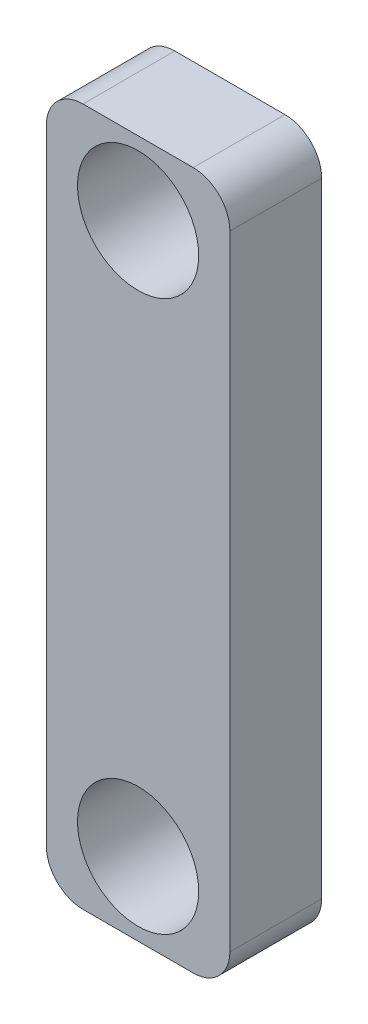
ISO-10303-21;
HEADER;
FILE_DESCRIPTION(('STEP AP214'),'2;1');
FILE_NAME('part.step','',(''),(''),'','','');
FILE_SCHEMA(('AUTOMOTIVE_DESIGN { 1 0 10303 214 1 1 1 1 }'));
ENDSEC;
DATA;
#1=APPLICATION_CONTEXT('core data for automotive mechanical design processes');
#2=APPLICATION_PROTOCOL_DEFINITION('international standard','automotive_design',2000,#1);
#3=PRODUCT_CONTEXT('',#1,'mechanical');
#4=PRODUCT('Part','Part','',(#3));
#5=PRODUCT_RELATED_PRODUCT_CATEGORY('part','',(#4));
#6=PRODUCT_DEFINITION_FORMATION('','',#4);
#7=PRODUCT_DEFINITION_CONTEXT('part definition',#1,'design');
#8=PRODUCT_DEFINITION('design','',#6,#7);
#9=PRODUCT_DEFINITION_SHAPE('','',#8);
#10=(LENGTH_UNIT() NAMED_UNIT(*) SI_UNIT(.MILLI.,.METRE.));
#11=(NAMED_UNIT(*) PLANE_ANGLE_UNIT() SI_UNIT($,.RADIAN.));
#12=(NAMED_UNIT(*) SI_UNIT($,.STERADIAN.) SOLID_ANGLE_UNIT());
#13=UNCERTAINTY_MEASURE_WITH_UNIT(LENGTH_MEASURE(1.E-05),#10,'distance_accuracy_value','');
#14=(GEOMETRIC_REPRESENTATION_CONTEXT(3) GLOBAL_UNCERTAINTY_ASSIGNED_CONTEXT((#13)) GLOBAL_UNIT_ASSIGNED_CONTEXT((#10,
#11,#12)) REPRESENTATION_CONTEXT('',''));
#15=CARTESIAN_POINT('',(0.,0.,0.));
#16=DIRECTION('',(0.,0.,1.));
#17=DIRECTION('',(1.,0.,0.));
#18=AXIS2_PLACEMENT_3D('',#15,#16,#17);
#19=CARTESIAN_POINT('',(0.,0.,25.));
#20=DIRECTION('',(0.,0.,-1.));
#21=DIRECTION('',(-1.,0.,0.));
#22=AXIS2_PLACEMENT_3D('',#19,#20,#21);
#23=PLANE('',#22);
#24=DIRECTION('',(0.,1.,0.));
#25=VECTOR('',#24,1.);
#26=CARTESIAN_POINT('',(50.,0.,25.));
#27=LINE('',#26,#25);
#28=CARTESIAN_POINT('',(50.,10.,25.));
#29=VERTEX_POINT('',#28);
#30=CARTESIAN_POINT('',(50.,180.,25.));
#31=VERTEX_POINT('',#30);
#32=EDGE_CURVE('E176',#29,#31,#27,.T.);
#33=ORIENTED_EDGE('',*,*,#32,.T.);
#34=CARTESIAN_POINT('',(40.,180.,25.));
#35=DIRECTION('',(0.,0.,-1.));
#36=DIRECTION('',(-1.,0.,0.));
#37=AXIS2_PLACEMENT_3D('',#34,#35,#36);
#38=CIRCLE('',#37,10.);
#39=CARTESIAN_POINT('',(40.,190.,25.));
#40=VERTEX_POINT('',#39);
#41=EDGE_CURVE('E153',#31,#40,#38,.F.);
#42=ORIENTED_EDGE('',*,*,#41,.T.);
#43=DIRECTION('',(-1.,0.,0.));
#44=VECTOR('',#43,1.);
#45=CARTESIAN_POINT('',(0.,190.,25.));
#46=LINE('',#45,#44);
#47=CARTESIAN_POINT('',(10.,190.,25.));
#48=VERTEX_POINT('',#47);
#49=EDGE_CURVE('E124',#40,#48,#46,.T.);
#50=ORIENTED_EDGE('',*,*,#49,.T.);
#51=CARTESIAN_POINT('',(10.,180.,25.));
#52=DIRECTION('',(0.,0.,-1.));
#53=DIRECTION('',(-1.,0.,0.));
#54=AXIS2_PLACEMENT_3D('',#51,#52,#53);
#55=CIRCLE('',#54,10.);
#56=CARTESIAN_POINT('',(0.,180.,25.));
#57=VERTEX_POINT('',#56);
#58=EDGE_CURVE('E151',#48,#57,#55,.F.);
#59=ORIENTED_EDGE('',*,*,#58,.T.);
#60=DIRECTION('',(0.,-1.,0.));
#61=VECTOR('',#60,1.);
#62=CARTESIAN_POINT('',(0.,0.,25.));
#63=LINE('',#62,#61);
#64=CARTESIAN_POINT('',(0.,10.,25.));
#65=VERTEX_POINT('',#64);
#66=EDGE_CURVE('E131',#57,#65,#63,.T.);
#67=ORIENTED_EDGE('',*,*,#66,.T.);
#68=CARTESIAN_POINT('',(10.,10.,25.));
#69=DIRECTION('',(0.,0.,-1.));
#70=DIRECTION('',(-1.,0.,0.));
#71=AXIS2_PLACEMENT_3D('',#68,#69,#70);
#72=CIRCLE('',#71,10.);
#73=CARTESIAN_POINT('',(10.,0.,25.));
#74=VERTEX_POINT('',#73);
#75=EDGE_CURVE('E59',#65,#74,#72,.F.);
#76=ORIENTED_EDGE('',*,*,#75,.T.);
#77=DIRECTION('',(1.,0.,0.));
#78=VECTOR('',#77,1.);
#79=CARTESIAN_POINT('',(0.,0.,25.));
#80=LINE('',#79,#78);
#81=CARTESIAN_POINT('',(40.,0.,25.));
#82=VERTEX_POINT('',#81);
#83=EDGE_CURVE('E134',#74,#82,#80,.T.);
#84=ORIENTED_EDGE('',*,*,#83,.T.);
#85=CARTESIAN_POINT('',(40.,10.,25.));
#86=DIRECTION('',(0.,0.,-1.));
#87=DIRECTION('',(-1.,0.,0.));
#88=AXIS2_PLACEMENT_3D('',#85,#86,#87);
#89=CIRCLE('',#88,10.);
#90=EDGE_CURVE('E148',#82,#29,#89,.F.);
#91=ORIENTED_EDGE('',*,*,#90,.T.);
#92=EDGE_LOOP('',(#33,#42,#50,#59,#67,#76,#84,#91));
#93=FACE_BOUND('',#92,.T.);
#94=CARTESIAN_POINT('',(25.,170.,25.));
#95=DIRECTION('',(0.,0.,1.));
#96=DIRECTION('',(1.,0.,0.));
#97=AXIS2_PLACEMENT_3D('',#94,#95,#96);
#98=CIRCLE('',#97,16.5);
#99=CARTESIAN_POINT('',(41.5,170.,25.));
#100=VERTEX_POINT('',#99);
#101=EDGE_CURVE('E169',#100,#100,#98,.T.);
#102=ORIENTED_EDGE('',*,*,#101,.F.);
#103=EDGE_LOOP('',(#102));
#104=FACE_BOUND('',#103,.T.);
#105=CARTESIAN_POINT('',(25.,20.,25.));
#106=DIRECTION('',(0.,0.,1.));
#107=DIRECTION('',(1.,0.,0.));
#108=AXIS2_PLACEMENT_3D('',#105,#106,#107);
#109=CIRCLE('',#108,16.5);
#110=CARTESIAN_POINT('',(41.5,20.,25.));
#111=VERTEX_POINT('',#110);
#112=EDGE_CURVE('E181',#111,#111,#109,.T.);
#113=ORIENTED_EDGE('',*,*,#112,.F.);
#114=EDGE_LOOP('',(#113));
#115=FACE_BOUND('',#114,.T.);
#116=ADVANCED_FACE('F38',(#93,#104,#115),#23,.F.);
#117=CARTESIAN_POINT('',(0.,0.,0.));
#118=DIRECTION('',(0.,0.,-1.));
#119=DIRECTION('',(-1.,0.,0.));
#120=AXIS2_PLACEMENT_3D('',#117,#118,#119);
#121=PLANE('',#120);
#122=CARTESIAN_POINT('',(25.,170.,0.));
#123=DIRECTION('',(0.,0.,1.));
#124=DIRECTION('',(1.,0.,0.));
#125=AXIS2_PLACEMENT_3D('',#122,#123,#124);
#126=CIRCLE('',#125,16.5);
#127=CARTESIAN_POINT('',(41.5,170.,0.));
#128=VERTEX_POINT('',#127);
#129=EDGE_CURVE('E172',#128,#128,#126,.T.);
#130=ORIENTED_EDGE('',*,*,#129,.T.);
#131=EDGE_LOOP('',(#130));
#132=FACE_BOUND('',#131,.T.);
#133=DIRECTION('',(-1.,0.,0.));
#134=VECTOR('',#133,1.);
#135=CARTESIAN_POINT('',(0.,190.,0.));
#136=LINE('',#135,#134);
#137=CARTESIAN_POINT('',(40.,190.,0.));
#138=VERTEX_POINT('',#137);
#139=CARTESIAN_POINT('',(10.,190.,0.));
#140=VERTEX_POINT('',#139);
#141=EDGE_CURVE('E121',#138,#140,#136,.T.);
#142=ORIENTED_EDGE('',*,*,#141,.F.);
#143=CARTESIAN_POINT('',(40.,180.,0.));
#144=DIRECTION('',(0.,0.,-1.));
#145=DIRECTION('',(-1.,0.,0.));
#146=AXIS2_PLACEMENT_3D('',#143,#144,#145);
#147=CIRCLE('',#146,10.);
#148=CARTESIAN_POINT('',(50.,180.,0.));
#149=VERTEX_POINT('',#148);
#150=EDGE_CURVE('E104',#138,#149,#147,.T.);
#151=ORIENTED_EDGE('',*,*,#150,.T.);
#152=DIRECTION('',(0.,1.,0.));
#153=VECTOR('',#152,1.);
#154=CARTESIAN_POINT('',(50.,0.,0.));
#155=LINE('',#154,#153);
#156=CARTESIAN_POINT('',(50.,10.,0.));
#157=VERTEX_POINT('',#156);
#158=EDGE_CURVE('E132',#157,#149,#155,.T.);
#159=ORIENTED_EDGE('',*,*,#158,.F.);
#160=CARTESIAN_POINT('',(40.,10.,0.));
#161=DIRECTION('',(0.,0.,-1.));
#162=DIRECTION('',(-1.,0.,0.));
#163=AXIS2_PLACEMENT_3D('',#160,#161,#162);
#164=CIRCLE('',#163,10.);
#165=CARTESIAN_POINT('',(40.,0.,0.));
#166=VERTEX_POINT('',#165);
#167=EDGE_CURVE('E125',#157,#166,#164,.T.);
#168=ORIENTED_EDGE('',*,*,#167,.T.);
#169=DIRECTION('',(1.,0.,0.));
#170=VECTOR('',#169,1.);
#171=CARTESIAN_POINT('',(0.,0.,0.));
#172=LINE('',#171,#170);
#173=CARTESIAN_POINT('',(10.,0.,0.));
#174=VERTEX_POINT('',#173);
#175=EDGE_CURVE('E136',#174,#166,#172,.T.);
#176=ORIENTED_EDGE('',*,*,#175,.F.);
#177=CARTESIAN_POINT('',(10.,10.,0.));
#178=DIRECTION('',(0.,0.,-1.));
#179=DIRECTION('',(-1.,0.,0.));
#180=AXIS2_PLACEMENT_3D('',#177,#178,#179);
#181=CIRCLE('',#180,10.);
#182=CARTESIAN_POINT('',(0.,10.,0.));
#183=VERTEX_POINT('',#182);
#184=EDGE_CURVE('E142',#174,#183,#181,.T.);
#185=ORIENTED_EDGE('',*,*,#184,.T.);
#186=DIRECTION('',(0.,-1.,0.));
#187=VECTOR('',#186,1.);
#188=CARTESIAN_POINT('',(0.,0.,0.));
#189=LINE('',#188,#187);
#190=CARTESIAN_POINT('',(0.,180.,0.));
#191=VERTEX_POINT('',#190);
#192=EDGE_CURVE('E164',#191,#183,#189,.T.);
#193=ORIENTED_EDGE('',*,*,#192,.F.);
#194=CARTESIAN_POINT('',(10.,180.,0.));
#195=DIRECTION('',(0.,0.,-1.));
#196=DIRECTION('',(-1.,0.,0.));
#197=AXIS2_PLACEMENT_3D('',#194,#195,#196);
#198=CIRCLE('',#197,10.);
#199=EDGE_CURVE('E115',#191,#140,#198,.T.);
#200=ORIENTED_EDGE('',*,*,#199,.T.);
#201=EDGE_LOOP('',(#142,#151,#159,#168,#176,#185,#193,#200));
#202=FACE_BOUND('',#201,.T.);
#203=CARTESIAN_POINT('',(25.,20.,0.));
#204=DIRECTION('',(0.,0.,1.));
#205=DIRECTION('',(1.,0.,0.));
#206=AXIS2_PLACEMENT_3D('',#203,#204,#205);
#207=CIRCLE('',#206,16.5);
#208=CARTESIAN_POINT('',(41.5,20.,0.));
#209=VERTEX_POINT('',#208);
#210=EDGE_CURVE('E183',#209,#209,#207,.T.);
#211=ORIENTED_EDGE('',*,*,#210,.T.);
#212=EDGE_LOOP('',(#211));
#213=FACE_BOUND('',#212,.T.);
#214=ADVANCED_FACE('F128',(#132,#202,#213),#121,.T.);
#215=CARTESIAN_POINT('',(0.,0.,25.));
#216=DIRECTION('',(1.,0.,0.));
#217=DIRECTION('',(0.,0.,-1.));
#218=AXIS2_PLACEMENT_3D('',#215,#216,#217);
#219=PLANE('',#218);
#220=ORIENTED_EDGE('',*,*,#66,.F.);
#221=DIRECTION('',(0.,0.,-1.));
#222=VECTOR('',#221,1.);
#223=CARTESIAN_POINT('',(0.,180.,25.));
#224=LINE('',#223,#222);
#225=EDGE_CURVE('E157',#57,#191,#224,.T.);
#226=ORIENTED_EDGE('',*,*,#225,.T.);
#227=ORIENTED_EDGE('',*,*,#192,.T.);
#228=DIRECTION('',(0.,0.,-1.));
#229=VECTOR('',#228,1.);
#230=CARTESIAN_POINT('',(0.,10.,25.));
#231=LINE('',#230,#229);
#232=EDGE_CURVE('E155',#183,#65,#231,.F.);
#233=ORIENTED_EDGE('',*,*,#232,.T.);
#234=EDGE_LOOP('',(#220,#226,#227,#233));
#235=FACE_BOUND('',#234,.T.);
#236=ADVANCED_FACE('F163',(#235),#219,.F.);
#237=CARTESIAN_POINT('',(0.,0.,25.));
#238=DIRECTION('',(0.,1.,0.));
#239=DIRECTION('',(0.,0.,1.));
#240=AXIS2_PLACEMENT_3D('',#237,#238,#239);
#241=PLANE('',#240);
#242=ORIENTED_EDGE('',*,*,#83,.F.);
#243=DIRECTION('',(0.,0.,-1.));
#244=VECTOR('',#243,1.);
#245=CARTESIAN_POINT('',(10.,0.,25.));
#246=LINE('',#245,#244);
#247=EDGE_CURVE('E11',#74,#174,#246,.T.);
#248=ORIENTED_EDGE('',*,*,#247,.T.);
#249=ORIENTED_EDGE('',*,*,#175,.T.);
#250=DIRECTION('',(0.,0.,-1.));
#251=VECTOR('',#250,1.);
#252=CARTESIAN_POINT('',(40.,0.,25.));
#253=LINE('',#252,#251);
#254=EDGE_CURVE('E46',#166,#82,#253,.F.);
#255=ORIENTED_EDGE('',*,*,#254,.T.);
#256=EDGE_LOOP('',(#242,#248,#249,#255));
#257=FACE_BOUND('',#256,.T.);
#258=ADVANCED_FACE('F210',(#257),#241,.F.);
#259=CARTESIAN_POINT('',(50.,0.,25.));
#260=DIRECTION('',(-1.,0.,0.));
#261=DIRECTION('',(0.,0.,1.));
#262=AXIS2_PLACEMENT_3D('',#259,#260,#261);
#263=PLANE('',#262);
#264=ORIENTED_EDGE('',*,*,#158,.T.);
#265=DIRECTION('',(0.,0.,-1.));
#266=VECTOR('',#265,1.);
#267=CARTESIAN_POINT('',(50.,180.,25.));
#268=LINE('',#267,#266);
#269=EDGE_CURVE('E109',#149,#31,#268,.F.);
#270=ORIENTED_EDGE('',*,*,#269,.T.);
#271=ORIENTED_EDGE('',*,*,#32,.F.);
#272=DIRECTION('',(0.,0.,-1.));
#273=VECTOR('',#272,1.);
#274=CARTESIAN_POINT('',(50.,10.,25.));
#275=LINE('',#274,#273);
#276=EDGE_CURVE('E114',#29,#157,#275,.T.);
#277=ORIENTED_EDGE('',*,*,#276,.T.);
#278=EDGE_LOOP('',(#264,#270,#271,#277));
#279=FACE_BOUND('',#278,.T.);
#280=ADVANCED_FACE('F207',(#279),#263,.F.);
#281=CARTESIAN_POINT('',(0.,190.,25.));
#282=DIRECTION('',(0.,-1.,0.));
#283=DIRECTION('',(0.,0.,-1.));
#284=AXIS2_PLACEMENT_3D('',#281,#282,#283);
#285=PLANE('',#284);
#286=ORIENTED_EDGE('',*,*,#49,.F.);
#287=DIRECTION('',(0.,0.,-1.));
#288=VECTOR('',#287,1.);
#289=CARTESIAN_POINT('',(40.,190.,25.));
#290=LINE('',#289,#288);
#291=EDGE_CURVE('E108',#40,#138,#290,.T.);
#292=ORIENTED_EDGE('',*,*,#291,.T.);
#293=ORIENTED_EDGE('',*,*,#141,.T.);
#294=DIRECTION('',(0.,0.,-1.));
#295=VECTOR('',#294,1.);
#296=CARTESIAN_POINT('',(10.,190.,25.));
#297=LINE('',#296,#295);
#298=EDGE_CURVE('E126',#140,#48,#297,.F.);
#299=ORIENTED_EDGE('',*,*,#298,.T.);
#300=EDGE_LOOP('',(#286,#292,#293,#299));
#301=FACE_BOUND('',#300,.T.);
#302=ADVANCED_FACE('F120',(#301),#285,.F.);
#303=CARTESIAN_POINT('',(25.,170.,25.));
#304=DIRECTION('',(0.,0.,-1.));
#305=DIRECTION('',(-1.,0.,0.));
#306=AXIS2_PLACEMENT_3D('',#303,#304,#305);
#307=CYLINDRICAL_SURFACE('',#306,16.5);
#308=ORIENTED_EDGE('',*,*,#101,.T.);
#309=EDGE_LOOP('',(#308));
#310=FACE_BOUND('',#309,.T.);
#311=ORIENTED_EDGE('',*,*,#129,.F.);
#312=EDGE_LOOP('',(#311));
#313=FACE_BOUND('',#312,.T.);
#314=ADVANCED_FACE('F202',(#310,#313),#307,.F.);
#315=CARTESIAN_POINT('',(25.,20.,25.));
#316=DIRECTION('',(0.,0.,-1.));
#317=DIRECTION('',(-1.,0.,0.));
#318=AXIS2_PLACEMENT_3D('',#315,#316,#317);
#319=CYLINDRICAL_SURFACE('',#318,16.5);
#320=ORIENTED_EDGE('',*,*,#112,.T.);
#321=EDGE_LOOP('',(#320));
#322=FACE_BOUND('',#321,.T.);
#323=ORIENTED_EDGE('',*,*,#210,.F.);
#324=EDGE_LOOP('',(#323));
#325=FACE_BOUND('',#324,.T.);
#326=ADVANCED_FACE('F189',(#322,#325),#319,.F.);
#327=CARTESIAN_POINT('',(40.,180.,25.));
#328=DIRECTION('',(0.,0.,-1.));
#329=DIRECTION('',(-1.,0.,0.));
#330=AXIS2_PLACEMENT_3D('',#327,#328,#329);
#331=CYLINDRICAL_SURFACE('',#330,10.);
#332=ORIENTED_EDGE('',*,*,#41,.F.);
#333=ORIENTED_EDGE('',*,*,#269,.F.);
#334=ORIENTED_EDGE('',*,*,#150,.F.);
#335=ORIENTED_EDGE('',*,*,#291,.F.);
#336=EDGE_LOOP('',(#332,#333,#334,#335));
#337=FACE_BOUND('',#336,.T.);
#338=ADVANCED_FACE('F107',(#337),#331,.T.);
#339=CARTESIAN_POINT('',(10.,180.,25.));
#340=DIRECTION('',(0.,0.,-1.));
#341=DIRECTION('',(-1.,0.,0.));
#342=AXIS2_PLACEMENT_3D('',#339,#340,#341);
#343=CYLINDRICAL_SURFACE('',#342,10.);
#344=ORIENTED_EDGE('',*,*,#58,.F.);
#345=ORIENTED_EDGE('',*,*,#298,.F.);
#346=ORIENTED_EDGE('',*,*,#199,.F.);
#347=ORIENTED_EDGE('',*,*,#225,.F.);
#348=EDGE_LOOP('',(#344,#345,#346,#347));
#349=FACE_BOUND('',#348,.T.);
#350=ADVANCED_FACE('F218',(#349),#343,.T.);
#351=CARTESIAN_POINT('',(10.,10.,25.));
#352=DIRECTION('',(0.,0.,-1.));
#353=DIRECTION('',(-1.,0.,0.));
#354=AXIS2_PLACEMENT_3D('',#351,#352,#353);
#355=CYLINDRICAL_SURFACE('',#354,10.);
#356=ORIENTED_EDGE('',*,*,#75,.F.);
#357=ORIENTED_EDGE('',*,*,#232,.F.);
#358=ORIENTED_EDGE('',*,*,#184,.F.);
#359=ORIENTED_EDGE('',*,*,#247,.F.);
#360=EDGE_LOOP('',(#356,#357,#358,#359));
#361=FACE_BOUND('',#360,.T.);
#362=ADVANCED_FACE('F220',(#361),#355,.T.);
#363=CARTESIAN_POINT('',(40.,10.,25.));
#364=DIRECTION('',(0.,0.,-1.));
#365=DIRECTION('',(-1.,0.,0.));
#366=AXIS2_PLACEMENT_3D('',#363,#364,#365);
#367=CYLINDRICAL_SURFACE('',#366,10.);
#368=ORIENTED_EDGE('',*,*,#90,.F.);
#369=ORIENTED_EDGE('',*,*,#254,.F.);
#370=ORIENTED_EDGE('',*,*,#167,.F.);
#371=ORIENTED_EDGE('',*,*,#276,.F.);
#372=EDGE_LOOP('',(#368,#369,#370,#371));
#373=FACE_BOUND('',#372,.T.);
#374=ADVANCED_FACE('F40',(#373),#367,.T.);
#375=CLOSED_SHELL('',(#116,#214,#236,#258,#280,#302,#314,#326,#338,#350,#362,#374));
#376=MANIFOLD_SOLID_BREP('B2',#375);
#377=ADVANCED_BREP_SHAPE_REPRESENTATION('',(#18,#376),#14);
#378=SHAPE_DEFINITION_REPRESENTATION(#9,#377);
ENDSEC;
END-ISO-10303-21;
